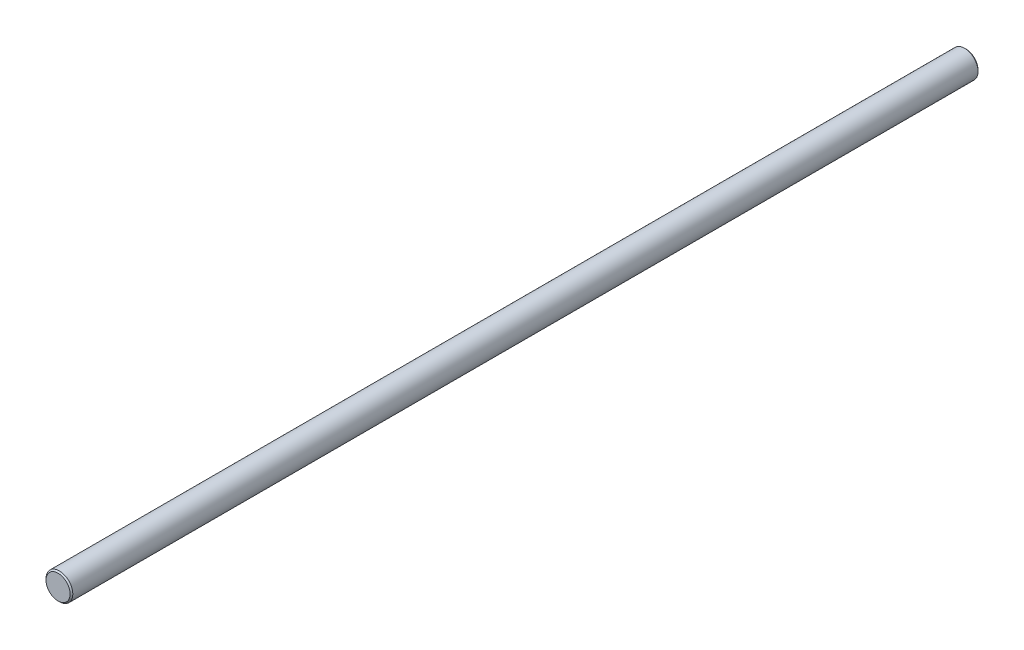
ISO-10303-21;
HEADER;
FILE_DESCRIPTION(('STEP AP214'),'2;1');
FILE_NAME('part.step','',(''),(''),'','','');
FILE_SCHEMA(('AUTOMOTIVE_DESIGN { 1 0 10303 214 1 1 1 1 }'));
ENDSEC;
DATA;
#1=APPLICATION_CONTEXT('core data for automotive mechanical design processes');
#2=APPLICATION_PROTOCOL_DEFINITION('international standard','automotive_design',2000,#1);
#3=PRODUCT_CONTEXT('',#1,'mechanical');
#4=PRODUCT('Part','Part','',(#3));
#5=PRODUCT_RELATED_PRODUCT_CATEGORY('part','',(#4));
#6=PRODUCT_DEFINITION_FORMATION('','',#4);
#7=PRODUCT_DEFINITION_CONTEXT('part definition',#1,'design');
#8=PRODUCT_DEFINITION('design','',#6,#7);
#9=PRODUCT_DEFINITION_SHAPE('','',#8);
#10=(LENGTH_UNIT() NAMED_UNIT(*) SI_UNIT(.MILLI.,.METRE.));
#11=(NAMED_UNIT(*) PLANE_ANGLE_UNIT() SI_UNIT($,.RADIAN.));
#12=(NAMED_UNIT(*) SI_UNIT($,.STERADIAN.) SOLID_ANGLE_UNIT());
#13=UNCERTAINTY_MEASURE_WITH_UNIT(LENGTH_MEASURE(1.E-05),#10,'distance_accuracy_value','');
#14=(GEOMETRIC_REPRESENTATION_CONTEXT(3) GLOBAL_UNCERTAINTY_ASSIGNED_CONTEXT((#13)) GLOBAL_UNIT_ASSIGNED_CONTEXT((#10,
#11,#12)) REPRESENTATION_CONTEXT('',''));
#15=CARTESIAN_POINT('',(0.,0.,0.));
#16=DIRECTION('',(0.,0.,1.));
#17=DIRECTION('',(1.,0.,0.));
#18=AXIS2_PLACEMENT_3D('',#15,#16,#17);
#19=CARTESIAN_POINT('',(0.,0.,0.));
#20=DIRECTION('',(0.,0.,1.));
#21=DIRECTION('',(1.,0.,0.));
#22=AXIS2_PLACEMENT_3D('',#19,#20,#21);
#23=CYLINDRICAL_SURFACE('',#22,5.);
#24=CARTESIAN_POINT('',(0.,0.,0.499999999995688));
#25=DIRECTION('',(0.,0.,-1.));
#26=DIRECTION('',(-1.,0.,0.));
#27=AXIS2_PLACEMENT_3D('',#24,#25,#26);
#28=CIRCLE('',#27,5.);
#29=CARTESIAN_POINT('',(-5.,0.,0.499999999995688));
#30=VERTEX_POINT('',#29);
#31=EDGE_CURVE('E41',#30,#30,#28,.F.);
#32=ORIENTED_EDGE('',*,*,#31,.T.);
#33=EDGE_LOOP('',(#32));
#34=FACE_BOUND('',#33,.T.);
#35=CARTESIAN_POINT('',(0.,0.,338.500000000004));
#36=DIRECTION('',(0.,0.,-1.));
#37=DIRECTION('',(-1.,0.,0.));
#38=AXIS2_PLACEMENT_3D('',#35,#36,#37);
#39=CIRCLE('',#38,5.);
#40=CARTESIAN_POINT('',(-5.,0.,338.500000000004));
#41=VERTEX_POINT('',#40);
#42=EDGE_CURVE('E45',#41,#41,#39,.T.);
#43=ORIENTED_EDGE('',*,*,#42,.T.);
#44=EDGE_LOOP('',(#43));
#45=FACE_BOUND('',#44,.T.);
#46=ADVANCED_FACE('F30',(#34,#45),#23,.T.);
#47=CARTESIAN_POINT('',(0.,0.,0.));
#48=DIRECTION('',(0.,0.,-1.));
#49=DIRECTION('',(-1.,0.,0.));
#50=AXIS2_PLACEMENT_3D('',#47,#48,#49);
#51=PLANE('',#50);
#52=CARTESIAN_POINT('',(0.,0.,0.));
#53=DIRECTION('',(0.,0.,-1.));
#54=DIRECTION('',(-1.,0.,0.));
#55=AXIS2_PLACEMENT_3D('',#52,#53,#54);
#56=CIRCLE('',#55,4.50000000000431);
#57=CARTESIAN_POINT('',(-4.50000000000431,0.,0.));
#58=VERTEX_POINT('',#57);
#59=EDGE_CURVE('E37',#58,#58,#56,.T.);
#60=ORIENTED_EDGE('',*,*,#59,.T.);
#61=EDGE_LOOP('',(#60));
#62=FACE_BOUND('',#61,.T.);
#63=ADVANCED_FACE('F61',(#62),#51,.T.);
#64=CARTESIAN_POINT('',(0.,0.,339.));
#65=DIRECTION('',(0.,0.,-1.));
#66=DIRECTION('',(-1.,0.,0.));
#67=AXIS2_PLACEMENT_3D('',#64,#65,#66);
#68=PLANE('',#67);
#69=CARTESIAN_POINT('',(0.,0.,339.));
#70=DIRECTION('',(0.,0.,-1.));
#71=DIRECTION('',(-1.,0.,0.));
#72=AXIS2_PLACEMENT_3D('',#69,#70,#71);
#73=CIRCLE('',#72,4.50000000000436);
#74=CARTESIAN_POINT('',(-4.50000000000436,0.,339.));
#75=VERTEX_POINT('',#74);
#76=EDGE_CURVE('E10',#75,#75,#73,.F.);
#77=ORIENTED_EDGE('',*,*,#76,.T.);
#78=EDGE_LOOP('',(#77));
#79=FACE_BOUND('',#78,.T.);
#80=ADVANCED_FACE('F58',(#79),#68,.F.);
#81=CARTESIAN_POINT('',(0.,0.,0.499999999995688));
#82=DIRECTION('',(0.,0.,1.));
#83=DIRECTION('',(1.,0.,0.));
#84=AXIS2_PLACEMENT_3D('',#81,#82,#83);
#85=CONICAL_SURFACE('',#84,5.,0.785398163397454);
#86=ORIENTED_EDGE('',*,*,#59,.F.);
#87=EDGE_LOOP('',(#86));
#88=FACE_BOUND('',#87,.T.);
#89=ORIENTED_EDGE('',*,*,#31,.F.);
#90=EDGE_LOOP('',(#89));
#91=FACE_BOUND('',#90,.T.);
#92=ADVANCED_FACE('F54',(#88,#91),#85,.T.);
#93=CARTESIAN_POINT('',(0.,0.,339.));
#94=DIRECTION('',(0.,0.,-1.));
#95=DIRECTION('',(-1.,0.,0.));
#96=AXIS2_PLACEMENT_3D('',#93,#94,#95);
#97=CONICAL_SURFACE('',#96,4.50000000000436,0.785398163397416);
#98=ORIENTED_EDGE('',*,*,#42,.F.);
#99=EDGE_LOOP('',(#98));
#100=FACE_BOUND('',#99,.T.);
#101=ORIENTED_EDGE('',*,*,#76,.F.);
#102=EDGE_LOOP('',(#101));
#103=FACE_BOUND('',#102,.T.);
#104=ADVANCED_FACE('F32',(#100,#103),#97,.T.);
#105=CLOSED_SHELL('',(#46,#63,#80,#92,#104));
#106=MANIFOLD_SOLID_BREP('B2',#105);
#107=ADVANCED_BREP_SHAPE_REPRESENTATION('',(#18,#106),#14);
#108=SHAPE_DEFINITION_REPRESENTATION(#9,#107);
ENDSEC;
END-ISO-10303-21;
